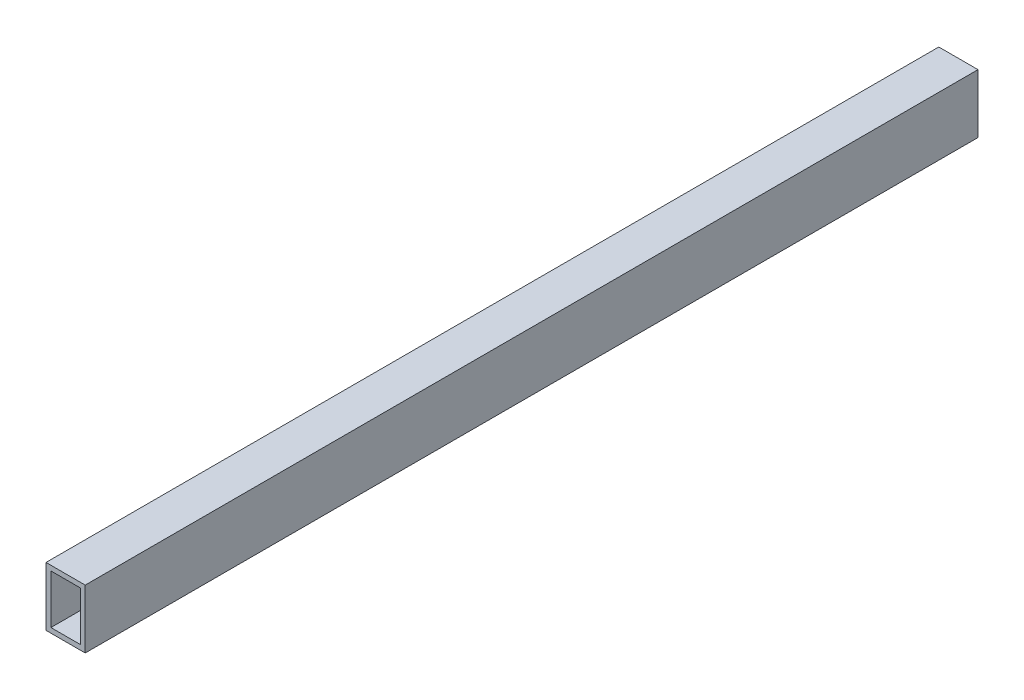
ISO-10303-21;
HEADER;
FILE_DESCRIPTION(('STEP AP214'),'2;1');
FILE_NAME('part.step','',(''),(''),'','','');
FILE_SCHEMA(('AUTOMOTIVE_DESIGN { 1 0 10303 214 1 1 1 1 }'));
ENDSEC;
DATA;
#1=APPLICATION_CONTEXT('core data for automotive mechanical design processes');
#2=APPLICATION_PROTOCOL_DEFINITION('international standard','automotive_design',2000,#1);
#3=PRODUCT_CONTEXT('',#1,'mechanical');
#4=PRODUCT('Part','Part','',(#3));
#5=PRODUCT_RELATED_PRODUCT_CATEGORY('part','',(#4));
#6=PRODUCT_DEFINITION_FORMATION('','',#4);
#7=PRODUCT_DEFINITION_CONTEXT('part definition',#1,'design');
#8=PRODUCT_DEFINITION('design','',#6,#7);
#9=PRODUCT_DEFINITION_SHAPE('','',#8);
#10=(LENGTH_UNIT() NAMED_UNIT(*) SI_UNIT(.MILLI.,.METRE.));
#11=(NAMED_UNIT(*) PLANE_ANGLE_UNIT() SI_UNIT($,.RADIAN.));
#12=(NAMED_UNIT(*) SI_UNIT($,.STERADIAN.) SOLID_ANGLE_UNIT());
#13=UNCERTAINTY_MEASURE_WITH_UNIT(LENGTH_MEASURE(1.E-05),#10,'distance_accuracy_value','');
#14=(GEOMETRIC_REPRESENTATION_CONTEXT(3) GLOBAL_UNCERTAINTY_ASSIGNED_CONTEXT((#13)) GLOBAL_UNIT_ASSIGNED_CONTEXT((#10,
#11,#12)) REPRESENTATION_CONTEXT('',''));
#15=CARTESIAN_POINT('',(0.,0.,0.));
#16=DIRECTION('',(0.,0.,1.));
#17=DIRECTION('',(1.,0.,0.));
#18=AXIS2_PLACEMENT_3D('',#15,#16,#17);
#19=CARTESIAN_POINT('',(0.,0.,578.104));
#20=DIRECTION('',(0.,0.,1.));
#21=DIRECTION('',(1.,0.,0.));
#22=AXIS2_PLACEMENT_3D('',#19,#20,#21);
#23=PLANE('',#22);
#24=DIRECTION('',(0.,1.,0.));
#25=VECTOR('',#24,1.);
#26=CARTESIAN_POINT('',(12.7,19.05,578.104));
#27=LINE('',#26,#25);
#28=CARTESIAN_POINT('',(12.7,-19.05,578.104));
#29=VERTEX_POINT('',#28);
#30=CARTESIAN_POINT('',(12.7,19.05,578.104));
#31=VERTEX_POINT('',#30);
#32=EDGE_CURVE('E133',#29,#31,#27,.T.);
#33=ORIENTED_EDGE('',*,*,#32,.T.);
#34=DIRECTION('',(-1.,0.,0.));
#35=VECTOR('',#34,1.);
#36=CARTESIAN_POINT('',(-12.7,19.05,578.104));
#37=LINE('',#36,#35);
#38=CARTESIAN_POINT('',(-12.7,19.05,578.104));
#39=VERTEX_POINT('',#38);
#40=EDGE_CURVE('E136',#31,#39,#37,.T.);
#41=ORIENTED_EDGE('',*,*,#40,.T.);
#42=DIRECTION('',(0.,-1.,0.));
#43=VECTOR('',#42,1.);
#44=CARTESIAN_POINT('',(-12.7,19.05,578.104));
#45=LINE('',#44,#43);
#46=CARTESIAN_POINT('',(-12.7,-19.05,578.104));
#47=VERTEX_POINT('',#46);
#48=EDGE_CURVE('E139',#39,#47,#45,.T.);
#49=ORIENTED_EDGE('',*,*,#48,.T.);
#50=DIRECTION('',(1.,0.,0.));
#51=VECTOR('',#50,1.);
#52=CARTESIAN_POINT('',(-12.7,-19.05,578.104));
#53=LINE('',#52,#51);
#54=EDGE_CURVE('E141',#47,#29,#53,.T.);
#55=ORIENTED_EDGE('',*,*,#54,.T.);
#56=EDGE_LOOP('',(#33,#41,#49,#55));
#57=FACE_BOUND('',#56,.T.);
#58=DIRECTION('',(-1.,0.,0.));
#59=VECTOR('',#58,1.);
#60=CARTESIAN_POINT('',(-9.525,15.875,578.104));
#61=LINE('',#60,#59);
#62=CARTESIAN_POINT('',(9.525,15.875,578.104));
#63=VERTEX_POINT('',#62);
#64=CARTESIAN_POINT('',(-9.525,15.875,578.104));
#65=VERTEX_POINT('',#64);
#66=EDGE_CURVE('E105',#63,#65,#61,.T.);
#67=ORIENTED_EDGE('',*,*,#66,.F.);
#68=DIRECTION('',(0.,1.,0.));
#69=VECTOR('',#68,1.);
#70=CARTESIAN_POINT('',(9.525,15.875,578.104));
#71=LINE('',#70,#69);
#72=CARTESIAN_POINT('',(9.525,-15.875,578.104));
#73=VERTEX_POINT('',#72);
#74=EDGE_CURVE('E97',#73,#63,#71,.T.);
#75=ORIENTED_EDGE('',*,*,#74,.F.);
#76=DIRECTION('',(1.,0.,0.));
#77=VECTOR('',#76,1.);
#78=CARTESIAN_POINT('',(-9.525,-15.875,578.104));
#79=LINE('',#78,#77);
#80=CARTESIAN_POINT('',(-9.525,-15.875,578.104));
#81=VERTEX_POINT('',#80);
#82=EDGE_CURVE('E119',#81,#73,#79,.T.);
#83=ORIENTED_EDGE('',*,*,#82,.F.);
#84=DIRECTION('',(0.,-1.,0.));
#85=VECTOR('',#84,1.);
#86=CARTESIAN_POINT('',(-9.525,15.875,578.104));
#87=LINE('',#86,#85);
#88=EDGE_CURVE('E117',#65,#81,#87,.T.);
#89=ORIENTED_EDGE('',*,*,#88,.F.);
#90=EDGE_LOOP('',(#67,#75,#83,#89));
#91=FACE_BOUND('',#90,.T.);
#92=ADVANCED_FACE('F32',(#57,#91),#23,.T.);
#93=CARTESIAN_POINT('',(0.,0.,0.));
#94=DIRECTION('',(0.,0.,1.));
#95=DIRECTION('',(1.,0.,0.));
#96=AXIS2_PLACEMENT_3D('',#93,#94,#95);
#97=PLANE('',#96);
#98=DIRECTION('',(0.,1.,0.));
#99=VECTOR('',#98,1.);
#100=CARTESIAN_POINT('',(12.7,19.05,0.));
#101=LINE('',#100,#99);
#102=CARTESIAN_POINT('',(12.7,-19.05,0.));
#103=VERTEX_POINT('',#102);
#104=CARTESIAN_POINT('',(12.7,19.05,0.));
#105=VERTEX_POINT('',#104);
#106=EDGE_CURVE('E113',#103,#105,#101,.T.);
#107=ORIENTED_EDGE('',*,*,#106,.F.);
#108=DIRECTION('',(1.,0.,0.));
#109=VECTOR('',#108,1.);
#110=CARTESIAN_POINT('',(-12.7,-19.05,0.));
#111=LINE('',#110,#109);
#112=CARTESIAN_POINT('',(-12.7,-19.05,0.));
#113=VERTEX_POINT('',#112);
#114=EDGE_CURVE('E137',#113,#103,#111,.T.);
#115=ORIENTED_EDGE('',*,*,#114,.F.);
#116=DIRECTION('',(0.,-1.,0.));
#117=VECTOR('',#116,1.);
#118=CARTESIAN_POINT('',(-12.7,19.05,0.));
#119=LINE('',#118,#117);
#120=CARTESIAN_POINT('',(-12.7,19.05,0.));
#121=VERTEX_POINT('',#120);
#122=EDGE_CURVE('E148',#121,#113,#119,.T.);
#123=ORIENTED_EDGE('',*,*,#122,.F.);
#124=DIRECTION('',(-1.,0.,0.));
#125=VECTOR('',#124,1.);
#126=CARTESIAN_POINT('',(-12.7,19.05,0.));
#127=LINE('',#126,#125);
#128=EDGE_CURVE('E146',#105,#121,#127,.T.);
#129=ORIENTED_EDGE('',*,*,#128,.F.);
#130=EDGE_LOOP('',(#107,#115,#123,#129));
#131=FACE_BOUND('',#130,.T.);
#132=DIRECTION('',(0.,1.,0.));
#133=VECTOR('',#132,1.);
#134=CARTESIAN_POINT('',(9.525,15.875,0.));
#135=LINE('',#134,#133);
#136=CARTESIAN_POINT('',(9.525,-15.875,0.));
#137=VERTEX_POINT('',#136);
#138=CARTESIAN_POINT('',(9.525,15.875,0.));
#139=VERTEX_POINT('',#138);
#140=EDGE_CURVE('E55',#137,#139,#135,.T.);
#141=ORIENTED_EDGE('',*,*,#140,.T.);
#142=DIRECTION('',(-1.,0.,0.));
#143=VECTOR('',#142,1.);
#144=CARTESIAN_POINT('',(-9.525,15.875,0.));
#145=LINE('',#144,#143);
#146=CARTESIAN_POINT('',(-9.525,15.875,0.));
#147=VERTEX_POINT('',#146);
#148=EDGE_CURVE('E112',#139,#147,#145,.T.);
#149=ORIENTED_EDGE('',*,*,#148,.T.);
#150=DIRECTION('',(0.,-1.,0.));
#151=VECTOR('',#150,1.);
#152=CARTESIAN_POINT('',(-9.525,15.875,0.));
#153=LINE('',#152,#151);
#154=CARTESIAN_POINT('',(-9.525,-15.875,0.));
#155=VERTEX_POINT('',#154);
#156=EDGE_CURVE('E125',#147,#155,#153,.T.);
#157=ORIENTED_EDGE('',*,*,#156,.T.);
#158=DIRECTION('',(1.,0.,0.));
#159=VECTOR('',#158,1.);
#160=CARTESIAN_POINT('',(-9.525,-15.875,0.));
#161=LINE('',#160,#159);
#162=EDGE_CURVE('E106',#155,#137,#161,.T.);
#163=ORIENTED_EDGE('',*,*,#162,.T.);
#164=EDGE_LOOP('',(#141,#149,#157,#163));
#165=FACE_BOUND('',#164,.T.);
#166=ADVANCED_FACE('F166',(#131,#165),#97,.F.);
#167=CARTESIAN_POINT('',(12.7,19.05,578.104));
#168=DIRECTION('',(-1.,0.,0.));
#169=DIRECTION('',(0.,-1.,0.));
#170=AXIS2_PLACEMENT_3D('',#167,#168,#169);
#171=PLANE('',#170);
#172=ORIENTED_EDGE('',*,*,#106,.T.);
#173=DIRECTION('',(0.,0.,-1.));
#174=VECTOR('',#173,1.);
#175=CARTESIAN_POINT('',(12.7,19.05,578.104));
#176=LINE('',#175,#174);
#177=EDGE_CURVE('E11',#31,#105,#176,.T.);
#178=ORIENTED_EDGE('',*,*,#177,.F.);
#179=ORIENTED_EDGE('',*,*,#32,.F.);
#180=DIRECTION('',(0.,0.,-1.));
#181=VECTOR('',#180,1.);
#182=CARTESIAN_POINT('',(12.7,-19.05,578.104));
#183=LINE('',#182,#181);
#184=EDGE_CURVE('E143',#29,#103,#183,.T.);
#185=ORIENTED_EDGE('',*,*,#184,.T.);
#186=EDGE_LOOP('',(#172,#178,#179,#185));
#187=FACE_BOUND('',#186,.T.);
#188=ADVANCED_FACE('F34',(#187),#171,.F.);
#189=CARTESIAN_POINT('',(-12.7,19.05,578.104));
#190=DIRECTION('',(0.,-1.,0.));
#191=DIRECTION('',(0.,0.,-1.));
#192=AXIS2_PLACEMENT_3D('',#189,#190,#191);
#193=PLANE('',#192);
#194=ORIENTED_EDGE('',*,*,#128,.T.);
#195=DIRECTION('',(0.,0.,-1.));
#196=VECTOR('',#195,1.);
#197=CARTESIAN_POINT('',(-12.7,19.05,578.104));
#198=LINE('',#197,#196);
#199=EDGE_CURVE('E40',#39,#121,#198,.T.);
#200=ORIENTED_EDGE('',*,*,#199,.F.);
#201=ORIENTED_EDGE('',*,*,#40,.F.);
#202=ORIENTED_EDGE('',*,*,#177,.T.);
#203=EDGE_LOOP('',(#194,#200,#201,#202));
#204=FACE_BOUND('',#203,.T.);
#205=ADVANCED_FACE('F176',(#204),#193,.F.);
#206=CARTESIAN_POINT('',(-12.7,19.05,578.104));
#207=DIRECTION('',(1.,0.,0.));
#208=DIRECTION('',(0.,1.,0.));
#209=AXIS2_PLACEMENT_3D('',#206,#207,#208);
#210=PLANE('',#209);
#211=ORIENTED_EDGE('',*,*,#122,.T.);
#212=DIRECTION('',(0.,0.,-1.));
#213=VECTOR('',#212,1.);
#214=CARTESIAN_POINT('',(-12.7,-19.05,578.104));
#215=LINE('',#214,#213);
#216=EDGE_CURVE('E153',#47,#113,#215,.T.);
#217=ORIENTED_EDGE('',*,*,#216,.F.);
#218=ORIENTED_EDGE('',*,*,#48,.F.);
#219=ORIENTED_EDGE('',*,*,#199,.T.);
#220=EDGE_LOOP('',(#211,#217,#218,#219));
#221=FACE_BOUND('',#220,.T.);
#222=ADVANCED_FACE('F160',(#221),#210,.F.);
#223=CARTESIAN_POINT('',(-12.7,-19.05,578.104));
#224=DIRECTION('',(0.,1.,0.));
#225=DIRECTION('',(0.,0.,1.));
#226=AXIS2_PLACEMENT_3D('',#223,#224,#225);
#227=PLANE('',#226);
#228=ORIENTED_EDGE('',*,*,#114,.T.);
#229=ORIENTED_EDGE('',*,*,#184,.F.);
#230=ORIENTED_EDGE('',*,*,#54,.F.);
#231=ORIENTED_EDGE('',*,*,#216,.T.);
#232=EDGE_LOOP('',(#228,#229,#230,#231));
#233=FACE_BOUND('',#232,.T.);
#234=ADVANCED_FACE('F170',(#233),#227,.F.);
#235=CARTESIAN_POINT('',(9.525,15.875,578.104));
#236=DIRECTION('',(-1.,0.,0.));
#237=DIRECTION('',(0.,-1.,0.));
#238=AXIS2_PLACEMENT_3D('',#235,#236,#237);
#239=PLANE('',#238);
#240=ORIENTED_EDGE('',*,*,#140,.F.);
#241=DIRECTION('',(0.,0.,-1.));
#242=VECTOR('',#241,1.);
#243=CARTESIAN_POINT('',(9.525,-15.875,578.104));
#244=LINE('',#243,#242);
#245=EDGE_CURVE('E101',#73,#137,#244,.T.);
#246=ORIENTED_EDGE('',*,*,#245,.F.);
#247=ORIENTED_EDGE('',*,*,#74,.T.);
#248=DIRECTION('',(0.,0.,-1.));
#249=VECTOR('',#248,1.);
#250=CARTESIAN_POINT('',(9.525,15.875,578.104));
#251=LINE('',#250,#249);
#252=EDGE_CURVE('E100',#63,#139,#251,.T.);
#253=ORIENTED_EDGE('',*,*,#252,.T.);
#254=EDGE_LOOP('',(#240,#246,#247,#253));
#255=FACE_BOUND('',#254,.T.);
#256=ADVANCED_FACE('F99',(#255),#239,.T.);
#257=CARTESIAN_POINT('',(-9.525,15.875,578.104));
#258=DIRECTION('',(0.,-1.,0.));
#259=DIRECTION('',(0.,0.,-1.));
#260=AXIS2_PLACEMENT_3D('',#257,#258,#259);
#261=PLANE('',#260);
#262=ORIENTED_EDGE('',*,*,#148,.F.);
#263=ORIENTED_EDGE('',*,*,#252,.F.);
#264=ORIENTED_EDGE('',*,*,#66,.T.);
#265=DIRECTION('',(0.,0.,-1.));
#266=VECTOR('',#265,1.);
#267=CARTESIAN_POINT('',(-9.525,15.875,578.104));
#268=LINE('',#267,#266);
#269=EDGE_CURVE('E114',#65,#147,#268,.T.);
#270=ORIENTED_EDGE('',*,*,#269,.T.);
#271=EDGE_LOOP('',(#262,#263,#264,#270));
#272=FACE_BOUND('',#271,.T.);
#273=ADVANCED_FACE('F109',(#272),#261,.T.);
#274=CARTESIAN_POINT('',(-9.525,15.875,578.104));
#275=DIRECTION('',(1.,0.,0.));
#276=DIRECTION('',(0.,1.,0.));
#277=AXIS2_PLACEMENT_3D('',#274,#275,#276);
#278=PLANE('',#277);
#279=ORIENTED_EDGE('',*,*,#156,.F.);
#280=ORIENTED_EDGE('',*,*,#269,.F.);
#281=ORIENTED_EDGE('',*,*,#88,.T.);
#282=DIRECTION('',(0.,0.,-1.));
#283=VECTOR('',#282,1.);
#284=CARTESIAN_POINT('',(-9.525,-15.875,578.104));
#285=LINE('',#284,#283);
#286=EDGE_CURVE('E47',#81,#155,#285,.T.);
#287=ORIENTED_EDGE('',*,*,#286,.T.);
#288=EDGE_LOOP('',(#279,#280,#281,#287));
#289=FACE_BOUND('',#288,.T.);
#290=ADVANCED_FACE('F199',(#289),#278,.T.);
#291=CARTESIAN_POINT('',(-9.525,-15.875,578.104));
#292=DIRECTION('',(0.,1.,0.));
#293=DIRECTION('',(0.,0.,1.));
#294=AXIS2_PLACEMENT_3D('',#291,#292,#293);
#295=PLANE('',#294);
#296=ORIENTED_EDGE('',*,*,#162,.F.);
#297=ORIENTED_EDGE('',*,*,#286,.F.);
#298=ORIENTED_EDGE('',*,*,#82,.T.);
#299=ORIENTED_EDGE('',*,*,#245,.T.);
#300=EDGE_LOOP('',(#296,#297,#298,#299));
#301=FACE_BOUND('',#300,.T.);
#302=ADVANCED_FACE('F203',(#301),#295,.T.);
#303=CLOSED_SHELL('',(#92,#166,#188,#205,#222,#234,#256,#273,#290,#302));
#304=MANIFOLD_SOLID_BREP('B2',#303);
#305=ADVANCED_BREP_SHAPE_REPRESENTATION('',(#18,#304),#14);
#306=SHAPE_DEFINITION_REPRESENTATION(#9,#305);
ENDSEC;
END-ISO-10303-21;
